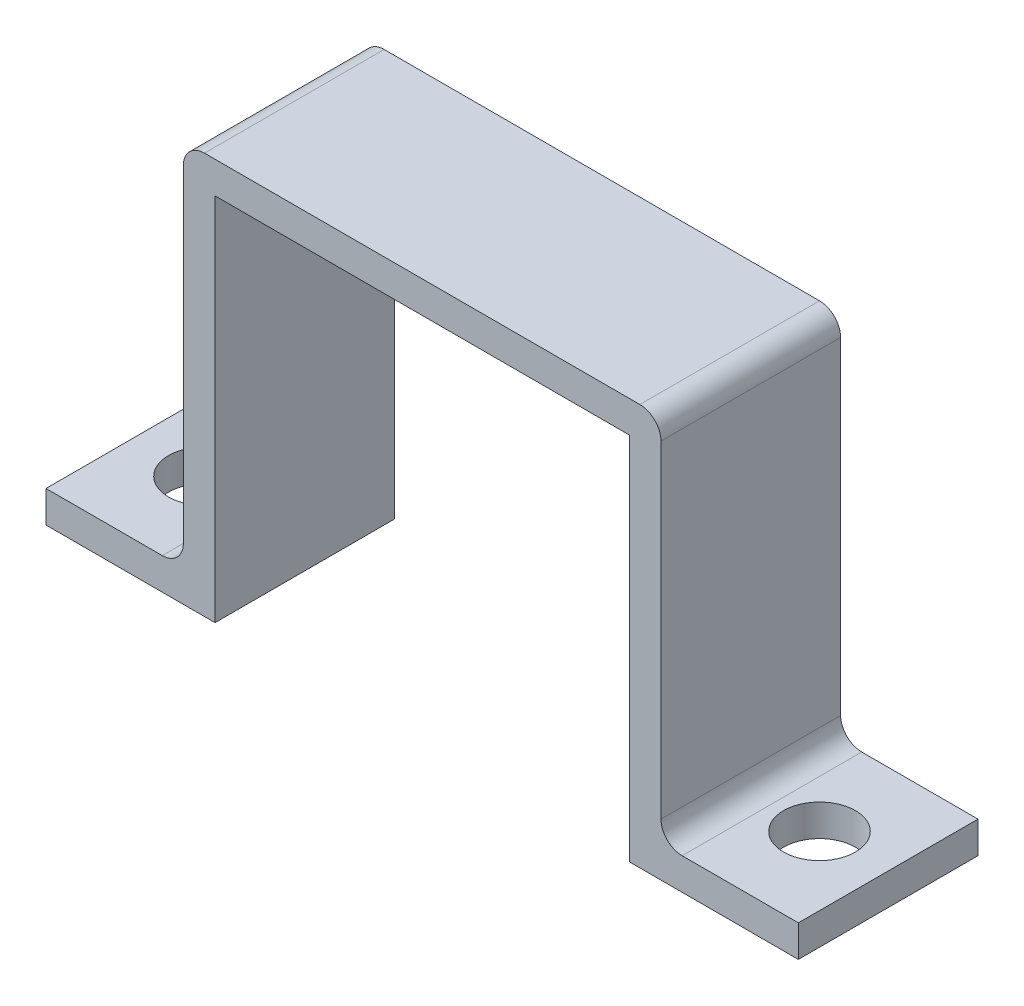
ISO-10303-21;
HEADER;
FILE_DESCRIPTION(('STEP AP214'),'2;1');
FILE_NAME('part.step','',(''),(''),'','','');
FILE_SCHEMA(('AUTOMOTIVE_DESIGN { 1 0 10303 214 1 1 1 1 }'));
ENDSEC;
DATA;
#1=APPLICATION_CONTEXT('core data for automotive mechanical design processes');
#2=APPLICATION_PROTOCOL_DEFINITION('international standard','automotive_design',2000,#1);
#3=PRODUCT_CONTEXT('',#1,'mechanical');
#4=PRODUCT('Part','Part','',(#3));
#5=PRODUCT_RELATED_PRODUCT_CATEGORY('part','',(#4));
#6=PRODUCT_DEFINITION_FORMATION('','',#4);
#7=PRODUCT_DEFINITION_CONTEXT('part definition',#1,'design');
#8=PRODUCT_DEFINITION('design','',#6,#7);
#9=PRODUCT_DEFINITION_SHAPE('','',#8);
#10=(LENGTH_UNIT() NAMED_UNIT(*) SI_UNIT(.MILLI.,.METRE.));
#11=(NAMED_UNIT(*) PLANE_ANGLE_UNIT() SI_UNIT($,.RADIAN.));
#12=(NAMED_UNIT(*) SI_UNIT($,.STERADIAN.) SOLID_ANGLE_UNIT());
#13=UNCERTAINTY_MEASURE_WITH_UNIT(LENGTH_MEASURE(1.E-05),#10,'distance_accuracy_value','');
#14=(GEOMETRIC_REPRESENTATION_CONTEXT(3) GLOBAL_UNCERTAINTY_ASSIGNED_CONTEXT((#13)) GLOBAL_UNIT_ASSIGNED_CONTEXT((#10,
#11,#12)) REPRESENTATION_CONTEXT('',''));
#15=CARTESIAN_POINT('',(0.,0.,0.));
#16=DIRECTION('',(0.,0.,1.));
#17=DIRECTION('',(1.,0.,0.));
#18=AXIS2_PLACEMENT_3D('',#15,#16,#17);
#19=CARTESIAN_POINT('',(9.8,0.,8.5));
#20=DIRECTION('',(1.,0.,0.));
#21=DIRECTION('',(0.,0.,-1.));
#22=AXIS2_PLACEMENT_3D('',#19,#20,#21);
#23=PLANE('',#22);
#24=DIRECTION('',(0.,-1.,0.));
#25=VECTOR('',#24,1.);
#26=CARTESIAN_POINT('',(9.8,0.,0.));
#27=LINE('',#26,#25);
#28=CARTESIAN_POINT('',(9.8,17.49,0.));
#29=VERTEX_POINT('',#28);
#30=CARTESIAN_POINT('',(9.8,0.,0.));
#31=VERTEX_POINT('',#30);
#32=EDGE_CURVE('E183',#29,#31,#27,.T.);
#33=ORIENTED_EDGE('',*,*,#32,.T.);
#34=DIRECTION('',(0.,0.,-1.));
#35=VECTOR('',#34,1.);
#36=CARTESIAN_POINT('',(9.8,0.,8.5));
#37=LINE('',#36,#35);
#38=CARTESIAN_POINT('',(9.8,0.,8.5));
#39=VERTEX_POINT('',#38);
#40=EDGE_CURVE('E162',#39,#31,#37,.T.);
#41=ORIENTED_EDGE('',*,*,#40,.F.);
#42=DIRECTION('',(0.,-1.,0.));
#43=VECTOR('',#42,1.);
#44=CARTESIAN_POINT('',(9.8,0.,8.5));
#45=LINE('',#44,#43);
#46=CARTESIAN_POINT('',(9.8,17.49,8.5));
#47=VERTEX_POINT('',#46);
#48=EDGE_CURVE('E169',#47,#39,#45,.T.);
#49=ORIENTED_EDGE('',*,*,#48,.F.);
#50=DIRECTION('',(0.,0.,-1.));
#51=VECTOR('',#50,1.);
#52=CARTESIAN_POINT('',(9.8,17.49,8.5));
#53=LINE('',#52,#51);
#54=EDGE_CURVE('E292',#47,#29,#53,.T.);
#55=ORIENTED_EDGE('',*,*,#54,.T.);
#56=EDGE_LOOP('',(#33,#41,#49,#55));
#57=FACE_BOUND('',#56,.T.);
#58=ADVANCED_FACE('F43',(#57),#23,.F.);
#59=CARTESIAN_POINT('',(9.8,0.,8.5));
#60=DIRECTION('',(0.,1.,0.));
#61=DIRECTION('',(-1.,0.,0.));
#62=AXIS2_PLACEMENT_3D('',#59,#60,#61);
#63=PLANE('',#62);
#64=CARTESIAN_POINT('',(14.55,0.,4.25));
#65=DIRECTION('',(0.,1.,0.));
#66=DIRECTION('',(-1.,0.,0.));
#67=AXIS2_PLACEMENT_3D('',#64,#65,#66);
#68=CIRCLE('',#67,1.7);
#69=CARTESIAN_POINT('',(12.85,0.,4.25));
#70=VERTEX_POINT('',#69);
#71=EDGE_CURVE('E296',#70,#70,#68,.T.);
#72=ORIENTED_EDGE('',*,*,#71,.T.);
#73=EDGE_LOOP('',(#72));
#74=FACE_BOUND('',#73,.T.);
#75=DIRECTION('',(1.,0.,0.));
#76=VECTOR('',#75,1.);
#77=CARTESIAN_POINT('',(9.8,0.,0.));
#78=LINE('',#77,#76);
#79=CARTESIAN_POINT('',(17.8,0.,0.));
#80=VERTEX_POINT('',#79);
#81=EDGE_CURVE('E295',#31,#80,#78,.T.);
#82=ORIENTED_EDGE('',*,*,#81,.T.);
#83=DIRECTION('',(0.,0.,-1.));
#84=VECTOR('',#83,1.);
#85=CARTESIAN_POINT('',(17.8,0.,8.5));
#86=LINE('',#85,#84);
#87=CARTESIAN_POINT('',(17.8,0.,8.5));
#88=VERTEX_POINT('',#87);
#89=EDGE_CURVE('E165',#88,#80,#86,.T.);
#90=ORIENTED_EDGE('',*,*,#89,.F.);
#91=DIRECTION('',(1.,0.,0.));
#92=VECTOR('',#91,1.);
#93=CARTESIAN_POINT('',(9.8,0.,8.5));
#94=LINE('',#93,#92);
#95=EDGE_CURVE('E158',#39,#88,#94,.T.);
#96=ORIENTED_EDGE('',*,*,#95,.F.);
#97=ORIENTED_EDGE('',*,*,#40,.T.);
#98=EDGE_LOOP('',(#82,#90,#96,#97));
#99=FACE_BOUND('',#98,.T.);
#100=ADVANCED_FACE('F160',(#74,#99),#63,.F.);
#101=CARTESIAN_POINT('',(17.8,0.,8.5));
#102=DIRECTION('',(-1.,0.,0.));
#103=DIRECTION('',(0.,0.,1.));
#104=AXIS2_PLACEMENT_3D('',#101,#102,#103);
#105=PLANE('',#104);
#106=DIRECTION('',(0.,1.,0.));
#107=VECTOR('',#106,1.);
#108=CARTESIAN_POINT('',(17.8,0.,0.));
#109=LINE('',#108,#107);
#110=CARTESIAN_POINT('',(17.8,1.5,0.));
#111=VERTEX_POINT('',#110);
#112=EDGE_CURVE('E255',#80,#111,#109,.T.);
#113=ORIENTED_EDGE('',*,*,#112,.T.);
#114=DIRECTION('',(0.,0.,-1.));
#115=VECTOR('',#114,1.);
#116=CARTESIAN_POINT('',(17.8,1.5,8.5));
#117=LINE('',#116,#115);
#118=CARTESIAN_POINT('',(17.8,1.5,8.5));
#119=VERTEX_POINT('',#118);
#120=EDGE_CURVE('E191',#119,#111,#117,.T.);
#121=ORIENTED_EDGE('',*,*,#120,.F.);
#122=DIRECTION('',(0.,1.,0.));
#123=VECTOR('',#122,1.);
#124=CARTESIAN_POINT('',(17.8,0.,8.5));
#125=LINE('',#124,#123);
#126=EDGE_CURVE('E168',#88,#119,#125,.T.);
#127=ORIENTED_EDGE('',*,*,#126,.F.);
#128=ORIENTED_EDGE('',*,*,#89,.T.);
#129=EDGE_LOOP('',(#113,#121,#127,#128));
#130=FACE_BOUND('',#129,.T.);
#131=ADVANCED_FACE('F393',(#130),#105,.F.);
#132=CARTESIAN_POINT('',(11.3,1.5,8.5));
#133=DIRECTION('',(0.,-1.,0.));
#134=DIRECTION('',(0.,0.,-1.));
#135=AXIS2_PLACEMENT_3D('',#132,#133,#134);
#136=PLANE('',#135);
#137=CARTESIAN_POINT('',(14.55,1.5,4.25));
#138=DIRECTION('',(0.,1.,0.));
#139=DIRECTION('',(-1.,0.,0.));
#140=AXIS2_PLACEMENT_3D('',#137,#138,#139);
#141=CIRCLE('',#140,1.7);
#142=CARTESIAN_POINT('',(12.85,1.5,4.25));
#143=VERTEX_POINT('',#142);
#144=EDGE_CURVE('E443',#143,#143,#141,.T.);
#145=ORIENTED_EDGE('',*,*,#144,.F.);
#146=EDGE_LOOP('',(#145));
#147=FACE_BOUND('',#146,.T.);
#148=DIRECTION('',(-1.,0.,0.));
#149=VECTOR('',#148,1.);
#150=CARTESIAN_POINT('',(11.3,1.5,0.));
#151=LINE('',#150,#149);
#152=CARTESIAN_POINT('',(12.3,1.5,0.));
#153=VERTEX_POINT('',#152);
#154=EDGE_CURVE('E242',#111,#153,#151,.T.);
#155=ORIENTED_EDGE('',*,*,#154,.T.);
#156=DIRECTION('',(0.,0.,-1.));
#157=VECTOR('',#156,1.);
#158=CARTESIAN_POINT('',(12.3,1.5,8.5));
#159=LINE('',#158,#157);
#160=CARTESIAN_POINT('',(12.3,1.5,8.5));
#161=VERTEX_POINT('',#160);
#162=EDGE_CURVE('E227',#153,#161,#159,.F.);
#163=ORIENTED_EDGE('',*,*,#162,.T.);
#164=DIRECTION('',(-1.,0.,0.));
#165=VECTOR('',#164,1.);
#166=CARTESIAN_POINT('',(11.3,1.5,8.5));
#167=LINE('',#166,#165);
#168=EDGE_CURVE('E261',#119,#161,#167,.T.);
#169=ORIENTED_EDGE('',*,*,#168,.F.);
#170=ORIENTED_EDGE('',*,*,#120,.T.);
#171=EDGE_LOOP('',(#155,#163,#169,#170));
#172=FACE_BOUND('',#171,.T.);
#173=ADVANCED_FACE('F250',(#147,#172),#136,.F.);
#174=CARTESIAN_POINT('',(11.3,1.5,8.5));
#175=DIRECTION('',(-1.,0.,0.));
#176=DIRECTION('',(0.,0.,1.));
#177=AXIS2_PLACEMENT_3D('',#174,#175,#176);
#178=PLANE('',#177);
#179=DIRECTION('',(0.,1.,0.));
#180=VECTOR('',#179,1.);
#181=CARTESIAN_POINT('',(11.3,1.5,0.));
#182=LINE('',#181,#180);
#183=CARTESIAN_POINT('',(11.3,2.5,0.));
#184=VERTEX_POINT('',#183);
#185=CARTESIAN_POINT('',(11.3,17.99,0.));
#186=VERTEX_POINT('',#185);
#187=EDGE_CURVE('E244',#184,#186,#182,.T.);
#188=ORIENTED_EDGE('',*,*,#187,.T.);
#189=DIRECTION('',(0.,0.,-1.));
#190=VECTOR('',#189,1.);
#191=CARTESIAN_POINT('',(11.3,17.99,8.5));
#192=LINE('',#191,#190);
#193=CARTESIAN_POINT('',(11.3,17.99,8.5));
#194=VERTEX_POINT('',#193);
#195=EDGE_CURVE('E208',#186,#194,#192,.F.);
#196=ORIENTED_EDGE('',*,*,#195,.T.);
#197=DIRECTION('',(0.,1.,0.));
#198=VECTOR('',#197,1.);
#199=CARTESIAN_POINT('',(11.3,1.5,8.5));
#200=LINE('',#199,#198);
#201=CARTESIAN_POINT('',(11.3,2.5,8.5));
#202=VERTEX_POINT('',#201);
#203=EDGE_CURVE('E259',#202,#194,#200,.T.);
#204=ORIENTED_EDGE('',*,*,#203,.F.);
#205=DIRECTION('',(0.,0.,-1.));
#206=VECTOR('',#205,1.);
#207=CARTESIAN_POINT('',(11.3,2.5,0.));
#208=LINE('',#207,#206);
#209=EDGE_CURVE('E204',#202,#184,#208,.T.);
#210=ORIENTED_EDGE('',*,*,#209,.T.);
#211=EDGE_LOOP('',(#188,#196,#204,#210));
#212=FACE_BOUND('',#211,.T.);
#213=ADVANCED_FACE('F263',(#212),#178,.F.);
#214=CARTESIAN_POINT('',(-11.3,18.99,8.5));
#215=DIRECTION('',(0.,-1.,0.));
#216=DIRECTION('',(1.,0.,0.));
#217=AXIS2_PLACEMENT_3D('',#214,#215,#216);
#218=PLANE('',#217);
#219=DIRECTION('',(-1.,0.,0.));
#220=VECTOR('',#219,1.);
#221=CARTESIAN_POINT('',(-11.3,18.99,8.5));
#222=LINE('',#221,#220);
#223=CARTESIAN_POINT('',(10.3,18.99,8.5));
#224=VERTEX_POINT('',#223);
#225=CARTESIAN_POINT('',(-10.3,18.99,8.5));
#226=VERTEX_POINT('',#225);
#227=EDGE_CURVE('E266',#224,#226,#222,.T.);
#228=ORIENTED_EDGE('',*,*,#227,.F.);
#229=DIRECTION('',(0.,0.,-1.));
#230=VECTOR('',#229,1.);
#231=CARTESIAN_POINT('',(10.3,18.99,8.5));
#232=LINE('',#231,#230);
#233=CARTESIAN_POINT('',(10.3,18.99,0.));
#234=VERTEX_POINT('',#233);
#235=EDGE_CURVE('E189',#224,#234,#232,.T.);
#236=ORIENTED_EDGE('',*,*,#235,.T.);
#237=DIRECTION('',(-1.,0.,0.));
#238=VECTOR('',#237,1.);
#239=CARTESIAN_POINT('',(-11.3,18.99,0.));
#240=LINE('',#239,#238);
#241=CARTESIAN_POINT('',(-10.3,18.99,0.));
#242=VERTEX_POINT('',#241);
#243=EDGE_CURVE('E303',#234,#242,#240,.T.);
#244=ORIENTED_EDGE('',*,*,#243,.T.);
#245=DIRECTION('',(0.,0.,-1.));
#246=VECTOR('',#245,1.);
#247=CARTESIAN_POINT('',(-10.3,18.99,8.5));
#248=LINE('',#247,#246);
#249=EDGE_CURVE('E185',#242,#226,#248,.F.);
#250=ORIENTED_EDGE('',*,*,#249,.T.);
#251=EDGE_LOOP('',(#228,#236,#244,#250));
#252=FACE_BOUND('',#251,.T.);
#253=ADVANCED_FACE('F374',(#252),#218,.F.);
#254=CARTESIAN_POINT('',(-11.3,1.5,8.5));
#255=DIRECTION('',(1.,0.,0.));
#256=DIRECTION('',(0.,1.,0.));
#257=AXIS2_PLACEMENT_3D('',#254,#255,#256);
#258=PLANE('',#257);
#259=DIRECTION('',(0.,-1.,0.));
#260=VECTOR('',#259,1.);
#261=CARTESIAN_POINT('',(-11.3,1.5,8.5));
#262=LINE('',#261,#260);
#263=CARTESIAN_POINT('',(-11.3,17.99,8.5));
#264=VERTEX_POINT('',#263);
#265=CARTESIAN_POINT('',(-11.3,2.5,8.5));
#266=VERTEX_POINT('',#265);
#267=EDGE_CURVE('E271',#264,#266,#262,.T.);
#268=ORIENTED_EDGE('',*,*,#267,.F.);
#269=DIRECTION('',(0.,0.,-1.));
#270=VECTOR('',#269,1.);
#271=CARTESIAN_POINT('',(-11.3,17.99,8.5));
#272=LINE('',#271,#270);
#273=CARTESIAN_POINT('',(-11.3,17.99,0.));
#274=VERTEX_POINT('',#273);
#275=EDGE_CURVE('E219',#264,#274,#272,.T.);
#276=ORIENTED_EDGE('',*,*,#275,.T.);
#277=DIRECTION('',(0.,-1.,0.));
#278=VECTOR('',#277,1.);
#279=CARTESIAN_POINT('',(-11.3,1.5,0.));
#280=LINE('',#279,#278);
#281=CARTESIAN_POINT('',(-11.3,2.5,0.));
#282=VERTEX_POINT('',#281);
#283=EDGE_CURVE('E307',#274,#282,#280,.T.);
#284=ORIENTED_EDGE('',*,*,#283,.T.);
#285=DIRECTION('',(0.,0.,-1.));
#286=VECTOR('',#285,1.);
#287=CARTESIAN_POINT('',(-11.3,2.5,8.5));
#288=LINE('',#287,#286);
#289=EDGE_CURVE('E67',#282,#266,#288,.F.);
#290=ORIENTED_EDGE('',*,*,#289,.T.);
#291=EDGE_LOOP('',(#268,#276,#284,#290));
#292=FACE_BOUND('',#291,.T.);
#293=ADVANCED_FACE('F366',(#292),#258,.F.);
#294=CARTESIAN_POINT('',(-11.3,1.5,8.5));
#295=DIRECTION('',(0.,-1.,0.));
#296=DIRECTION('',(1.,0.,0.));
#297=AXIS2_PLACEMENT_3D('',#294,#295,#296);
#298=PLANE('',#297);
#299=CARTESIAN_POINT('',(-14.55,1.5,4.25));
#300=DIRECTION('',(0.,-1.,0.));
#301=DIRECTION('',(1.,0.,0.));
#302=AXIS2_PLACEMENT_3D('',#299,#300,#301);
#303=CIRCLE('',#302,1.7);
#304=CARTESIAN_POINT('',(-12.85,1.5,4.25));
#305=VERTEX_POINT('',#304);
#306=EDGE_CURVE('E439',#305,#305,#303,.T.);
#307=ORIENTED_EDGE('',*,*,#306,.T.);
#308=EDGE_LOOP('',(#307));
#309=FACE_BOUND('',#308,.T.);
#310=DIRECTION('',(-1.,0.,0.));
#311=VECTOR('',#310,1.);
#312=CARTESIAN_POINT('',(-11.3,1.5,8.5));
#313=LINE('',#312,#311);
#314=CARTESIAN_POINT('',(-12.3,1.5,8.5));
#315=VERTEX_POINT('',#314);
#316=CARTESIAN_POINT('',(-17.8,1.5,8.5));
#317=VERTEX_POINT('',#316);
#318=EDGE_CURVE('E278',#315,#317,#313,.T.);
#319=ORIENTED_EDGE('',*,*,#318,.F.);
#320=DIRECTION('',(0.,0.,-1.));
#321=VECTOR('',#320,1.);
#322=CARTESIAN_POINT('',(-12.3,1.5,0.));
#323=LINE('',#322,#321);
#324=CARTESIAN_POINT('',(-12.3,1.5,0.));
#325=VERTEX_POINT('',#324);
#326=EDGE_CURVE('E223',#315,#325,#323,.T.);
#327=ORIENTED_EDGE('',*,*,#326,.T.);
#328=DIRECTION('',(-1.,0.,0.));
#329=VECTOR('',#328,1.);
#330=CARTESIAN_POINT('',(-11.3,1.5,0.));
#331=LINE('',#330,#329);
#332=CARTESIAN_POINT('',(-17.8,1.5,0.));
#333=VERTEX_POINT('',#332);
#334=EDGE_CURVE('E310',#325,#333,#331,.T.);
#335=ORIENTED_EDGE('',*,*,#334,.T.);
#336=DIRECTION('',(0.,0.,-1.));
#337=VECTOR('',#336,1.);
#338=CARTESIAN_POINT('',(-17.8,1.5,8.5));
#339=LINE('',#338,#337);
#340=EDGE_CURVE('E338',#317,#333,#339,.T.);
#341=ORIENTED_EDGE('',*,*,#340,.F.);
#342=EDGE_LOOP('',(#319,#327,#335,#341));
#343=FACE_BOUND('',#342,.T.);
#344=ADVANCED_FACE('F362',(#309,#343),#298,.F.);
#345=CARTESIAN_POINT('',(-17.8,0.,8.5));
#346=DIRECTION('',(1.,0.,0.));
#347=DIRECTION('',(0.,0.,-1.));
#348=AXIS2_PLACEMENT_3D('',#345,#346,#347);
#349=PLANE('',#348);
#350=DIRECTION('',(0.,-1.,0.));
#351=VECTOR('',#350,1.);
#352=CARTESIAN_POINT('',(-17.8,0.,0.));
#353=LINE('',#352,#351);
#354=CARTESIAN_POINT('',(-17.8,0.,0.));
#355=VERTEX_POINT('',#354);
#356=EDGE_CURVE('E313',#333,#355,#353,.T.);
#357=ORIENTED_EDGE('',*,*,#356,.T.);
#358=DIRECTION('',(0.,0.,-1.));
#359=VECTOR('',#358,1.);
#360=CARTESIAN_POINT('',(-17.8,0.,8.5));
#361=LINE('',#360,#359);
#362=CARTESIAN_POINT('',(-17.8,0.,8.5));
#363=VERTEX_POINT('',#362);
#364=EDGE_CURVE('E334',#363,#355,#361,.T.);
#365=ORIENTED_EDGE('',*,*,#364,.F.);
#366=DIRECTION('',(0.,-1.,0.));
#367=VECTOR('',#366,1.);
#368=CARTESIAN_POINT('',(-17.8,0.,8.5));
#369=LINE('',#368,#367);
#370=EDGE_CURVE('E281',#317,#363,#369,.T.);
#371=ORIENTED_EDGE('',*,*,#370,.F.);
#372=ORIENTED_EDGE('',*,*,#340,.T.);
#373=EDGE_LOOP('',(#357,#365,#371,#372));
#374=FACE_BOUND('',#373,.T.);
#375=ADVANCED_FACE('F346',(#374),#349,.F.);
#376=CARTESIAN_POINT('',(-9.8,0.,8.5));
#377=DIRECTION('',(0.,1.,0.));
#378=DIRECTION('',(-1.,0.,0.));
#379=AXIS2_PLACEMENT_3D('',#376,#377,#378);
#380=PLANE('',#379);
#381=CARTESIAN_POINT('',(-14.55,0.,4.25));
#382=DIRECTION('',(0.,-1.,0.));
#383=DIRECTION('',(1.,0.,0.));
#384=AXIS2_PLACEMENT_3D('',#381,#382,#383);
#385=CIRCLE('',#384,1.7);
#386=CARTESIAN_POINT('',(-12.85,0.,4.25));
#387=VERTEX_POINT('',#386);
#388=EDGE_CURVE('E436',#387,#387,#385,.T.);
#389=ORIENTED_EDGE('',*,*,#388,.F.);
#390=EDGE_LOOP('',(#389));
#391=FACE_BOUND('',#390,.T.);
#392=DIRECTION('',(1.,0.,0.));
#393=VECTOR('',#392,1.);
#394=CARTESIAN_POINT('',(-9.8,0.,0.));
#395=LINE('',#394,#393);
#396=CARTESIAN_POINT('',(-9.8,0.,0.));
#397=VERTEX_POINT('',#396);
#398=EDGE_CURVE('E316',#355,#397,#395,.T.);
#399=ORIENTED_EDGE('',*,*,#398,.T.);
#400=DIRECTION('',(0.,0.,-1.));
#401=VECTOR('',#400,1.);
#402=CARTESIAN_POINT('',(-9.8,0.,8.5));
#403=LINE('',#402,#401);
#404=CARTESIAN_POINT('',(-9.8,0.,8.5));
#405=VERTEX_POINT('',#404);
#406=EDGE_CURVE('E330',#405,#397,#403,.T.);
#407=ORIENTED_EDGE('',*,*,#406,.F.);
#408=DIRECTION('',(1.,0.,0.));
#409=VECTOR('',#408,1.);
#410=CARTESIAN_POINT('',(-9.8,0.,8.5));
#411=LINE('',#410,#409);
#412=EDGE_CURVE('E284',#363,#405,#411,.T.);
#413=ORIENTED_EDGE('',*,*,#412,.F.);
#414=ORIENTED_EDGE('',*,*,#364,.T.);
#415=EDGE_LOOP('',(#399,#407,#413,#414));
#416=FACE_BOUND('',#415,.T.);
#417=ADVANCED_FACE('F355',(#391,#416),#380,.F.);
#418=CARTESIAN_POINT('',(-9.8,0.,8.5));
#419=DIRECTION('',(-1.,0.,0.));
#420=DIRECTION('',(0.,-1.,0.));
#421=AXIS2_PLACEMENT_3D('',#418,#419,#420);
#422=PLANE('',#421);
#423=DIRECTION('',(0.,1.,0.));
#424=VECTOR('',#423,1.);
#425=CARTESIAN_POINT('',(-9.8,0.,0.));
#426=LINE('',#425,#424);
#427=CARTESIAN_POINT('',(-9.8,17.49,0.));
#428=VERTEX_POINT('',#427);
#429=EDGE_CURVE('E319',#397,#428,#426,.T.);
#430=ORIENTED_EDGE('',*,*,#429,.T.);
#431=DIRECTION('',(0.,0.,-1.));
#432=VECTOR('',#431,1.);
#433=CARTESIAN_POINT('',(-9.8,17.49,8.5));
#434=LINE('',#433,#432);
#435=CARTESIAN_POINT('',(-9.8,17.49,8.5));
#436=VERTEX_POINT('',#435);
#437=EDGE_CURVE('E326',#436,#428,#434,.T.);
#438=ORIENTED_EDGE('',*,*,#437,.F.);
#439=DIRECTION('',(0.,1.,0.));
#440=VECTOR('',#439,1.);
#441=CARTESIAN_POINT('',(-9.8,0.,8.5));
#442=LINE('',#441,#440);
#443=EDGE_CURVE('E287',#405,#436,#442,.T.);
#444=ORIENTED_EDGE('',*,*,#443,.F.);
#445=ORIENTED_EDGE('',*,*,#406,.T.);
#446=EDGE_LOOP('',(#430,#438,#444,#445));
#447=FACE_BOUND('',#446,.T.);
#448=ADVANCED_FACE('F359',(#447),#422,.F.);
#449=CARTESIAN_POINT('',(-9.8,17.49,8.5));
#450=DIRECTION('',(0.,1.,0.));
#451=DIRECTION('',(-1.,0.,0.));
#452=AXIS2_PLACEMENT_3D('',#449,#450,#451);
#453=PLANE('',#452);
#454=DIRECTION('',(1.,0.,0.));
#455=VECTOR('',#454,1.);
#456=CARTESIAN_POINT('',(-9.8,17.49,0.));
#457=LINE('',#456,#455);
#458=EDGE_CURVE('E180',#428,#29,#457,.T.);
#459=ORIENTED_EDGE('',*,*,#458,.T.);
#460=ORIENTED_EDGE('',*,*,#54,.F.);
#461=DIRECTION('',(1.,0.,0.));
#462=VECTOR('',#461,1.);
#463=CARTESIAN_POINT('',(-9.8,17.49,8.5));
#464=LINE('',#463,#462);
#465=EDGE_CURVE('E175',#436,#47,#464,.T.);
#466=ORIENTED_EDGE('',*,*,#465,.F.);
#467=ORIENTED_EDGE('',*,*,#437,.T.);
#468=EDGE_LOOP('',(#459,#460,#466,#467));
#469=FACE_BOUND('',#468,.T.);
#470=ADVANCED_FACE('F419',(#469),#453,.F.);
#471=CARTESIAN_POINT('',(0.,0.,8.5));
#472=DIRECTION('',(0.,0.,-1.));
#473=DIRECTION('',(-1.,0.,0.));
#474=AXIS2_PLACEMENT_3D('',#471,#472,#473);
#475=PLANE('',#474);
#476=ORIENTED_EDGE('',*,*,#203,.T.);
#477=CARTESIAN_POINT('',(10.3,17.99,8.5));
#478=DIRECTION('',(0.,0.,-1.));
#479=DIRECTION('',(-1.,0.,0.));
#480=AXIS2_PLACEMENT_3D('',#477,#478,#479);
#481=CIRCLE('',#480,1.);
#482=EDGE_CURVE('E214',#194,#224,#481,.F.);
#483=ORIENTED_EDGE('',*,*,#482,.T.);
#484=ORIENTED_EDGE('',*,*,#227,.T.);
#485=CARTESIAN_POINT('',(-10.3,17.99,8.5));
#486=DIRECTION('',(0.,0.,-1.));
#487=DIRECTION('',(-1.,0.,0.));
#488=AXIS2_PLACEMENT_3D('',#485,#486,#487);
#489=CIRCLE('',#488,1.);
#490=EDGE_CURVE('E211',#226,#264,#489,.F.);
#491=ORIENTED_EDGE('',*,*,#490,.T.);
#492=ORIENTED_EDGE('',*,*,#267,.T.);
#493=CARTESIAN_POINT('',(-12.3,2.5,8.5));
#494=DIRECTION('',(0.,0.,-1.));
#495=DIRECTION('',(-1.,0.,0.));
#496=AXIS2_PLACEMENT_3D('',#493,#494,#495);
#497=CIRCLE('',#496,1.);
#498=EDGE_CURVE('E59',#266,#315,#497,.T.);
#499=ORIENTED_EDGE('',*,*,#498,.T.);
#500=ORIENTED_EDGE('',*,*,#318,.T.);
#501=ORIENTED_EDGE('',*,*,#370,.T.);
#502=ORIENTED_EDGE('',*,*,#412,.T.);
#503=ORIENTED_EDGE('',*,*,#443,.T.);
#504=ORIENTED_EDGE('',*,*,#465,.T.);
#505=ORIENTED_EDGE('',*,*,#48,.T.);
#506=ORIENTED_EDGE('',*,*,#95,.T.);
#507=ORIENTED_EDGE('',*,*,#126,.T.);
#508=ORIENTED_EDGE('',*,*,#168,.T.);
#509=CARTESIAN_POINT('',(12.3,2.5,8.5));
#510=DIRECTION('',(0.,0.,-1.));
#511=DIRECTION('',(-1.,0.,0.));
#512=AXIS2_PLACEMENT_3D('',#509,#510,#511);
#513=CIRCLE('',#512,1.);
#514=EDGE_CURVE('E11',#161,#202,#513,.T.);
#515=ORIENTED_EDGE('',*,*,#514,.T.);
#516=EDGE_LOOP('',(#476,#483,#484,#491,#492,#499,#500,#501,#502,#503,#504,#505,#506,#507,#508,#515));
#517=FACE_BOUND('',#516,.T.);
#518=ADVANCED_FACE('F173',(#517),#475,.F.);
#519=CARTESIAN_POINT('',(0.,0.,0.));
#520=DIRECTION('',(0.,0.,-1.));
#521=DIRECTION('',(-1.,0.,0.));
#522=AXIS2_PLACEMENT_3D('',#519,#520,#521);
#523=PLANE('',#522);
#524=ORIENTED_EDGE('',*,*,#243,.F.);
#525=CARTESIAN_POINT('',(10.3,17.99,0.));
#526=DIRECTION('',(0.,0.,-1.));
#527=DIRECTION('',(-1.,0.,0.));
#528=AXIS2_PLACEMENT_3D('',#525,#526,#527);
#529=CIRCLE('',#528,1.);
#530=EDGE_CURVE('E201',#234,#186,#529,.T.);
#531=ORIENTED_EDGE('',*,*,#530,.T.);
#532=ORIENTED_EDGE('',*,*,#187,.F.);
#533=CARTESIAN_POINT('',(12.3,2.5,0.));
#534=DIRECTION('',(0.,0.,-1.));
#535=DIRECTION('',(-1.,0.,0.));
#536=AXIS2_PLACEMENT_3D('',#533,#534,#535);
#537=CIRCLE('',#536,1.);
#538=EDGE_CURVE('E52',#184,#153,#537,.F.);
#539=ORIENTED_EDGE('',*,*,#538,.T.);
#540=ORIENTED_EDGE('',*,*,#154,.F.);
#541=ORIENTED_EDGE('',*,*,#112,.F.);
#542=ORIENTED_EDGE('',*,*,#81,.F.);
#543=ORIENTED_EDGE('',*,*,#32,.F.);
#544=ORIENTED_EDGE('',*,*,#458,.F.);
#545=ORIENTED_EDGE('',*,*,#429,.F.);
#546=ORIENTED_EDGE('',*,*,#398,.F.);
#547=ORIENTED_EDGE('',*,*,#356,.F.);
#548=ORIENTED_EDGE('',*,*,#334,.F.);
#549=CARTESIAN_POINT('',(-12.3,2.5,0.));
#550=DIRECTION('',(0.,0.,-1.));
#551=DIRECTION('',(-1.,0.,0.));
#552=AXIS2_PLACEMENT_3D('',#549,#550,#551);
#553=CIRCLE('',#552,1.);
#554=EDGE_CURVE('E230',#325,#282,#553,.F.);
#555=ORIENTED_EDGE('',*,*,#554,.T.);
#556=ORIENTED_EDGE('',*,*,#283,.F.);
#557=CARTESIAN_POINT('',(-10.3,17.99,0.));
#558=DIRECTION('',(0.,0.,-1.));
#559=DIRECTION('',(-1.,0.,0.));
#560=AXIS2_PLACEMENT_3D('',#557,#558,#559);
#561=CIRCLE('',#560,1.);
#562=EDGE_CURVE('E198',#274,#242,#561,.T.);
#563=ORIENTED_EDGE('',*,*,#562,.T.);
#564=EDGE_LOOP('',(#524,#531,#532,#539,#540,#541,#542,#543,#544,#545,#546,#547,#548,#555,#556,#563));
#565=FACE_BOUND('',#564,.T.);
#566=ADVANCED_FACE('F240',(#565),#523,.T.);
#567=CARTESIAN_POINT('',(14.55,0.,4.25));
#568=DIRECTION('',(0.,1.,0.));
#569=DIRECTION('',(-1.,0.,0.));
#570=AXIS2_PLACEMENT_3D('',#567,#568,#569);
#571=CYLINDRICAL_SURFACE('',#570,1.7);
#572=ORIENTED_EDGE('',*,*,#71,.F.);
#573=EDGE_LOOP('',(#572));
#574=FACE_BOUND('',#573,.T.);
#575=ORIENTED_EDGE('',*,*,#144,.T.);
#576=EDGE_LOOP('',(#575));
#577=FACE_BOUND('',#576,.T.);
#578=ADVANCED_FACE('F379',(#574,#577),#571,.F.);
#579=CARTESIAN_POINT('',(10.3,17.99,8.5));
#580=DIRECTION('',(0.,0.,-1.));
#581=DIRECTION('',(-1.,0.,0.));
#582=AXIS2_PLACEMENT_3D('',#579,#580,#581);
#583=CYLINDRICAL_SURFACE('',#582,1.);
#584=ORIENTED_EDGE('',*,*,#482,.F.);
#585=ORIENTED_EDGE('',*,*,#195,.F.);
#586=ORIENTED_EDGE('',*,*,#530,.F.);
#587=ORIENTED_EDGE('',*,*,#235,.F.);
#588=EDGE_LOOP('',(#584,#585,#586,#587));
#589=FACE_BOUND('',#588,.T.);
#590=ADVANCED_FACE('F377',(#589),#583,.T.);
#591=CARTESIAN_POINT('',(-10.3,17.99,8.5));
#592=DIRECTION('',(0.,0.,-1.));
#593=DIRECTION('',(-1.,0.,0.));
#594=AXIS2_PLACEMENT_3D('',#591,#592,#593);
#595=CYLINDRICAL_SURFACE('',#594,1.);
#596=ORIENTED_EDGE('',*,*,#490,.F.);
#597=ORIENTED_EDGE('',*,*,#249,.F.);
#598=ORIENTED_EDGE('',*,*,#562,.F.);
#599=ORIENTED_EDGE('',*,*,#275,.F.);
#600=EDGE_LOOP('',(#596,#597,#598,#599));
#601=FACE_BOUND('',#600,.T.);
#602=ADVANCED_FACE('F370',(#601),#595,.T.);
#603=CARTESIAN_POINT('',(-12.3,2.5,8.5));
#604=DIRECTION('',(0.,0.,1.));
#605=DIRECTION('',(1.,0.,0.));
#606=AXIS2_PLACEMENT_3D('',#603,#604,#605);
#607=CYLINDRICAL_SURFACE('',#606,1.);
#608=ORIENTED_EDGE('',*,*,#498,.F.);
#609=ORIENTED_EDGE('',*,*,#289,.F.);
#610=ORIENTED_EDGE('',*,*,#554,.F.);
#611=ORIENTED_EDGE('',*,*,#326,.F.);
#612=EDGE_LOOP('',(#608,#609,#610,#611));
#613=FACE_BOUND('',#612,.T.);
#614=ADVANCED_FACE('F364',(#613),#607,.F.);
#615=CARTESIAN_POINT('',(12.3,2.5,8.5));
#616=DIRECTION('',(0.,0.,1.));
#617=DIRECTION('',(1.,0.,0.));
#618=AXIS2_PLACEMENT_3D('',#615,#616,#617);
#619=CYLINDRICAL_SURFACE('',#618,1.);
#620=ORIENTED_EDGE('',*,*,#514,.F.);
#621=ORIENTED_EDGE('',*,*,#162,.F.);
#622=ORIENTED_EDGE('',*,*,#538,.F.);
#623=ORIENTED_EDGE('',*,*,#209,.F.);
#624=EDGE_LOOP('',(#620,#621,#622,#623));
#625=FACE_BOUND('',#624,.T.);
#626=ADVANCED_FACE('F45',(#625),#619,.F.);
#627=CARTESIAN_POINT('',(-14.55,0.,4.25));
#628=DIRECTION('',(0.,1.,0.));
#629=DIRECTION('',(-1.,0.,0.));
#630=AXIS2_PLACEMENT_3D('',#627,#628,#629);
#631=CYLINDRICAL_SURFACE('',#630,1.7);
#632=ORIENTED_EDGE('',*,*,#388,.T.);
#633=EDGE_LOOP('',(#632));
#634=FACE_BOUND('',#633,.T.);
#635=ORIENTED_EDGE('',*,*,#306,.F.);
#636=EDGE_LOOP('',(#635));
#637=FACE_BOUND('',#636,.T.);
#638=ADVANCED_FACE('F427',(#634,#637),#631,.F.);
#639=CLOSED_SHELL('',(#58,#100,#131,#173,#213,#253,#293,#344,#375,#417,#448,#470,#518,#566,#578,
#590,#602,#614,#626,#638));
#640=MANIFOLD_SOLID_BREP('B2',#639);
#641=ADVANCED_BREP_SHAPE_REPRESENTATION('',(#18,#640),#14);
#642=SHAPE_DEFINITION_REPRESENTATION(#9,#641);
ENDSEC;
END-ISO-10303-21;
